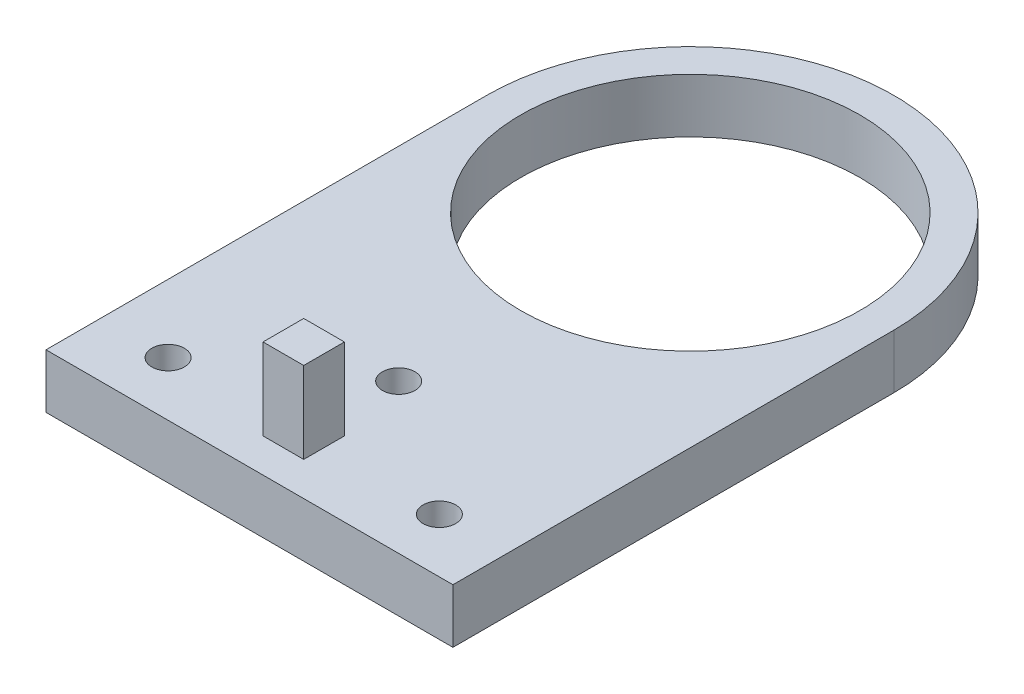
ISO-10303-21;
HEADER;
FILE_DESCRIPTION(('STEP AP214'),'2;1');
FILE_NAME('part.step','',(''),(''),'','','');
FILE_SCHEMA(('AUTOMOTIVE_DESIGN { 1 0 10303 214 1 1 1 1 }'));
ENDSEC;
DATA;
#1=APPLICATION_CONTEXT('core data for automotive mechanical design processes');
#2=APPLICATION_PROTOCOL_DEFINITION('international standard','automotive_design',2000,#1);
#3=PRODUCT_CONTEXT('',#1,'mechanical');
#4=PRODUCT('Part','Part','',(#3));
#5=PRODUCT_RELATED_PRODUCT_CATEGORY('part','',(#4));
#6=PRODUCT_DEFINITION_FORMATION('','',#4);
#7=PRODUCT_DEFINITION_CONTEXT('part definition',#1,'design');
#8=PRODUCT_DEFINITION('design','',#6,#7);
#9=PRODUCT_DEFINITION_SHAPE('','',#8);
#10=(LENGTH_UNIT() NAMED_UNIT(*) SI_UNIT(.MILLI.,.METRE.));
#11=(NAMED_UNIT(*) PLANE_ANGLE_UNIT() SI_UNIT($,.RADIAN.));
#12=(NAMED_UNIT(*) SI_UNIT($,.STERADIAN.) SOLID_ANGLE_UNIT());
#13=UNCERTAINTY_MEASURE_WITH_UNIT(LENGTH_MEASURE(1.E-05),#10,'distance_accuracy_value','');
#14=(GEOMETRIC_REPRESENTATION_CONTEXT(3) GLOBAL_UNCERTAINTY_ASSIGNED_CONTEXT((#13)) GLOBAL_UNIT_ASSIGNED_CONTEXT((#10,
#11,#12)) REPRESENTATION_CONTEXT('',''));
#15=CARTESIAN_POINT('',(0.,0.,0.));
#16=DIRECTION('',(0.,0.,1.));
#17=DIRECTION('',(1.,0.,0.));
#18=AXIS2_PLACEMENT_3D('',#15,#16,#17);
#19=CARTESIAN_POINT('',(0.,4.,-32.5));
#20=DIRECTION('',(0.,-1.,0.));
#21=DIRECTION('',(0.,0.,-1.));
#22=AXIS2_PLACEMENT_3D('',#19,#20,#21);
#23=PLANE('',#22);
#24=CARTESIAN_POINT('',(10.,4.,-4.));
#25=DIRECTION('',(0.,-1.,0.));
#26=DIRECTION('',(0.,0.,-1.));
#27=AXIS2_PLACEMENT_3D('',#24,#25,#26);
#28=CIRCLE('',#27,1.2);
#29=CARTESIAN_POINT('',(10.,4.,-5.2));
#30=VERTEX_POINT('',#29);
#31=EDGE_CURVE('E37',#30,#30,#28,.T.);
#32=ORIENTED_EDGE('',*,*,#31,.T.);
#33=EDGE_LOOP('',(#32));
#34=FACE_BOUND('',#33,.T.);
#35=CARTESIAN_POINT('',(-10.,4.,-4.));
#36=DIRECTION('',(0.,-1.,0.));
#37=DIRECTION('',(0.,0.,-1.));
#38=AXIS2_PLACEMENT_3D('',#35,#36,#37);
#39=CIRCLE('',#38,1.2);
#40=CARTESIAN_POINT('',(-10.,4.,-5.2));
#41=VERTEX_POINT('',#40);
#42=EDGE_CURVE('E161',#41,#41,#39,.T.);
#43=ORIENTED_EDGE('',*,*,#42,.T.);
#44=EDGE_LOOP('',(#43));
#45=FACE_BOUND('',#44,.T.);
#46=CARTESIAN_POINT('',(0.,4.,-11.));
#47=DIRECTION('',(0.,-1.,0.));
#48=DIRECTION('',(0.,0.,-1.));
#49=AXIS2_PLACEMENT_3D('',#46,#47,#48);
#50=CIRCLE('',#49,1.2);
#51=CARTESIAN_POINT('',(0.,4.,-12.2));
#52=VERTEX_POINT('',#51);
#53=EDGE_CURVE('E158',#52,#52,#50,.T.);
#54=ORIENTED_EDGE('',*,*,#53,.T.);
#55=EDGE_LOOP('',(#54));
#56=FACE_BOUND('',#55,.T.);
#57=DIRECTION('',(0.,0.,1.));
#58=VECTOR('',#57,1.);
#59=CARTESIAN_POINT('',(-15.,4.,0.));
#60=LINE('',#59,#58);
#61=CARTESIAN_POINT('',(-15.,4.,-32.5));
#62=VERTEX_POINT('',#61);
#63=CARTESIAN_POINT('',(-15.,4.,0.));
#64=VERTEX_POINT('',#63);
#65=EDGE_CURVE('E133',#62,#64,#60,.T.);
#66=ORIENTED_EDGE('',*,*,#65,.T.);
#67=DIRECTION('',(1.,0.,0.));
#68=VECTOR('',#67,1.);
#69=CARTESIAN_POINT('',(-15.,4.,0.));
#70=LINE('',#69,#68);
#71=CARTESIAN_POINT('',(15.,4.,0.));
#72=VERTEX_POINT('',#71);
#73=EDGE_CURVE('E136',#64,#72,#70,.T.);
#74=ORIENTED_EDGE('',*,*,#73,.T.);
#75=DIRECTION('',(0.,0.,-1.));
#76=VECTOR('',#75,1.);
#77=CARTESIAN_POINT('',(15.,4.,0.));
#78=LINE('',#77,#76);
#79=CARTESIAN_POINT('',(15.,4.,-32.5));
#80=VERTEX_POINT('',#79);
#81=EDGE_CURVE('E139',#72,#80,#78,.T.);
#82=ORIENTED_EDGE('',*,*,#81,.T.);
#83=CARTESIAN_POINT('',(0.,4.,-32.5));
#84=DIRECTION('',(0.,1.,0.));
#85=DIRECTION('',(0.,0.,-1.));
#86=AXIS2_PLACEMENT_3D('',#83,#84,#85);
#87=CIRCLE('',#86,15.);
#88=EDGE_CURVE('E141',#80,#62,#87,.T.);
#89=ORIENTED_EDGE('',*,*,#88,.T.);
#90=EDGE_LOOP('',(#66,#74,#82,#89));
#91=FACE_BOUND('',#90,.T.);
#92=CARTESIAN_POINT('',(0.,4.,-32.5));
#93=DIRECTION('',(0.,1.,0.));
#94=DIRECTION('',(0.,0.,1.));
#95=AXIS2_PLACEMENT_3D('',#92,#93,#94);
#96=CIRCLE('',#95,12.5);
#97=CARTESIAN_POINT('',(0.,4.,-20.));
#98=VERTEX_POINT('',#97);
#99=EDGE_CURVE('E124',#98,#98,#96,.T.);
#100=ORIENTED_EDGE('',*,*,#99,.F.);
#101=EDGE_LOOP('',(#100));
#102=FACE_BOUND('',#101,.T.);
#103=DIRECTION('',(0.,0.,1.));
#104=VECTOR('',#103,1.);
#105=CARTESIAN_POINT('',(-1.5,4.,-5.5));
#106=LINE('',#105,#104);
#107=CARTESIAN_POINT('',(-1.5,4.,-5.5));
#108=VERTEX_POINT('',#107);
#109=CARTESIAN_POINT('',(-1.5,4.,-2.5));
#110=VERTEX_POINT('',#109);
#111=EDGE_CURVE('E120',#108,#110,#106,.T.);
#112=ORIENTED_EDGE('',*,*,#111,.F.);
#113=DIRECTION('',(-1.,0.,0.));
#114=VECTOR('',#113,1.);
#115=CARTESIAN_POINT('',(-1.5,4.,-5.5));
#116=LINE('',#115,#114);
#117=CARTESIAN_POINT('',(1.5,4.,-5.5));
#118=VERTEX_POINT('',#117);
#119=EDGE_CURVE('E117',#118,#108,#116,.T.);
#120=ORIENTED_EDGE('',*,*,#119,.F.);
#121=DIRECTION('',(0.,0.,-1.));
#122=VECTOR('',#121,1.);
#123=CARTESIAN_POINT('',(1.5,4.,-5.5));
#124=LINE('',#123,#122);
#125=CARTESIAN_POINT('',(1.5,4.,-2.5));
#126=VERTEX_POINT('',#125);
#127=EDGE_CURVE('E55',#126,#118,#124,.T.);
#128=ORIENTED_EDGE('',*,*,#127,.F.);
#129=DIRECTION('',(1.,0.,0.));
#130=VECTOR('',#129,1.);
#131=CARTESIAN_POINT('',(-1.5,4.,-2.5));
#132=LINE('',#131,#130);
#133=EDGE_CURVE('E50',#110,#126,#132,.T.);
#134=ORIENTED_EDGE('',*,*,#133,.F.);
#135=EDGE_LOOP('',(#112,#120,#128,#134));
#136=FACE_BOUND('',#135,.T.);
#137=ADVANCED_FACE('F33',(#34,#45,#56,#91,#102,#136),#23,.F.);
#138=CARTESIAN_POINT('',(-15.,4.,0.));
#139=DIRECTION('',(1.,0.,0.));
#140=DIRECTION('',(0.,0.,-1.));
#141=AXIS2_PLACEMENT_3D('',#138,#139,#140);
#142=PLANE('',#141);
#143=DIRECTION('',(0.,0.,1.));
#144=VECTOR('',#143,1.);
#145=CARTESIAN_POINT('',(-15.,0.,0.));
#146=LINE('',#145,#144);
#147=CARTESIAN_POINT('',(-15.,0.,-32.5));
#148=VERTEX_POINT('',#147);
#149=CARTESIAN_POINT('',(-15.,0.,0.));
#150=VERTEX_POINT('',#149);
#151=EDGE_CURVE('E131',#148,#150,#146,.T.);
#152=ORIENTED_EDGE('',*,*,#151,.T.);
#153=DIRECTION('',(0.,-1.,0.));
#154=VECTOR('',#153,1.);
#155=CARTESIAN_POINT('',(-15.,4.,0.));
#156=LINE('',#155,#154);
#157=EDGE_CURVE('E11',#64,#150,#156,.T.);
#158=ORIENTED_EDGE('',*,*,#157,.F.);
#159=ORIENTED_EDGE('',*,*,#65,.F.);
#160=DIRECTION('',(0.,-1.,0.));
#161=VECTOR('',#160,1.);
#162=CARTESIAN_POINT('',(-15.,4.,-32.5));
#163=LINE('',#162,#161);
#164=EDGE_CURVE('E143',#62,#148,#163,.T.);
#165=ORIENTED_EDGE('',*,*,#164,.T.);
#166=EDGE_LOOP('',(#152,#158,#159,#165));
#167=FACE_BOUND('',#166,.T.);
#168=ADVANCED_FACE('F35',(#167),#142,.F.);
#169=CARTESIAN_POINT('',(-15.,4.,0.));
#170=DIRECTION('',(0.,0.,-1.));
#171=DIRECTION('',(-1.,0.,0.));
#172=AXIS2_PLACEMENT_3D('',#169,#170,#171);
#173=PLANE('',#172);
#174=DIRECTION('',(1.,0.,0.));
#175=VECTOR('',#174,1.);
#176=CARTESIAN_POINT('',(-15.,0.,0.));
#177=LINE('',#176,#175);
#178=CARTESIAN_POINT('',(15.,0.,0.));
#179=VERTEX_POINT('',#178);
#180=EDGE_CURVE('E146',#150,#179,#177,.T.);
#181=ORIENTED_EDGE('',*,*,#180,.T.);
#182=DIRECTION('',(0.,-1.,0.));
#183=VECTOR('',#182,1.);
#184=CARTESIAN_POINT('',(15.,4.,0.));
#185=LINE('',#184,#183);
#186=EDGE_CURVE('E42',#72,#179,#185,.T.);
#187=ORIENTED_EDGE('',*,*,#186,.F.);
#188=ORIENTED_EDGE('',*,*,#73,.F.);
#189=ORIENTED_EDGE('',*,*,#157,.T.);
#190=EDGE_LOOP('',(#181,#187,#188,#189));
#191=FACE_BOUND('',#190,.T.);
#192=ADVANCED_FACE('F208',(#191),#173,.F.);
#193=CARTESIAN_POINT('',(15.,4.,0.));
#194=DIRECTION('',(-1.,0.,0.));
#195=DIRECTION('',(0.,0.,1.));
#196=AXIS2_PLACEMENT_3D('',#193,#194,#195);
#197=PLANE('',#196);
#198=DIRECTION('',(0.,0.,-1.));
#199=VECTOR('',#198,1.);
#200=CARTESIAN_POINT('',(15.,0.,0.));
#201=LINE('',#200,#199);
#202=CARTESIAN_POINT('',(15.,0.,-32.5));
#203=VERTEX_POINT('',#202);
#204=EDGE_CURVE('E148',#179,#203,#201,.T.);
#205=ORIENTED_EDGE('',*,*,#204,.T.);
#206=DIRECTION('',(0.,-1.,0.));
#207=VECTOR('',#206,1.);
#208=CARTESIAN_POINT('',(15.,4.,-32.5));
#209=LINE('',#208,#207);
#210=EDGE_CURVE('E153',#80,#203,#209,.T.);
#211=ORIENTED_EDGE('',*,*,#210,.F.);
#212=ORIENTED_EDGE('',*,*,#81,.F.);
#213=ORIENTED_EDGE('',*,*,#186,.T.);
#214=EDGE_LOOP('',(#205,#211,#212,#213));
#215=FACE_BOUND('',#214,.T.);
#216=ADVANCED_FACE('F222',(#215),#197,.F.);
#217=CARTESIAN_POINT('',(0.,4.,-32.5));
#218=DIRECTION('',(0.,-1.,0.));
#219=DIRECTION('',(0.,0.,-1.));
#220=AXIS2_PLACEMENT_3D('',#217,#218,#219);
#221=CYLINDRICAL_SURFACE('',#220,15.);
#222=CARTESIAN_POINT('',(0.,0.,-32.5));
#223=DIRECTION('',(0.,1.,0.));
#224=DIRECTION('',(0.,0.,-1.));
#225=AXIS2_PLACEMENT_3D('',#222,#223,#224);
#226=CIRCLE('',#225,15.);
#227=EDGE_CURVE('E137',#203,#148,#226,.T.);
#228=ORIENTED_EDGE('',*,*,#227,.T.);
#229=ORIENTED_EDGE('',*,*,#164,.F.);
#230=ORIENTED_EDGE('',*,*,#88,.F.);
#231=ORIENTED_EDGE('',*,*,#210,.T.);
#232=EDGE_LOOP('',(#228,#229,#230,#231));
#233=FACE_BOUND('',#232,.T.);
#234=ADVANCED_FACE('F218',(#233),#221,.T.);
#235=CARTESIAN_POINT('',(0.,0.,-32.5));
#236=DIRECTION('',(0.,-1.,0.));
#237=DIRECTION('',(0.,0.,-1.));
#238=AXIS2_PLACEMENT_3D('',#235,#236,#237);
#239=PLANE('',#238);
#240=CARTESIAN_POINT('',(10.,0.,-4.));
#241=DIRECTION('',(0.,-1.,0.));
#242=DIRECTION('',(0.,0.,-1.));
#243=AXIS2_PLACEMENT_3D('',#240,#241,#242);
#244=CIRCLE('',#243,2.7);
#245=CARTESIAN_POINT('',(10.,0.,-6.7));
#246=VERTEX_POINT('',#245);
#247=EDGE_CURVE('E357',#246,#246,#244,.T.);
#248=ORIENTED_EDGE('',*,*,#247,.F.);
#249=EDGE_LOOP('',(#248));
#250=FACE_BOUND('',#249,.T.);
#251=CARTESIAN_POINT('',(-10.,0.,-4.));
#252=DIRECTION('',(0.,-1.,0.));
#253=DIRECTION('',(0.,0.,-1.));
#254=AXIS2_PLACEMENT_3D('',#251,#252,#253);
#255=CIRCLE('',#254,2.7);
#256=CARTESIAN_POINT('',(-10.,0.,-6.7));
#257=VERTEX_POINT('',#256);
#258=EDGE_CURVE('E170',#257,#257,#255,.T.);
#259=ORIENTED_EDGE('',*,*,#258,.F.);
#260=EDGE_LOOP('',(#259));
#261=FACE_BOUND('',#260,.T.);
#262=CARTESIAN_POINT('',(0.,0.,-11.));
#263=DIRECTION('',(0.,-1.,0.));
#264=DIRECTION('',(0.,0.,-1.));
#265=AXIS2_PLACEMENT_3D('',#262,#263,#264);
#266=CIRCLE('',#265,2.7);
#267=CARTESIAN_POINT('',(0.,0.,-13.7));
#268=VERTEX_POINT('',#267);
#269=EDGE_CURVE('E163',#268,#268,#266,.T.);
#270=ORIENTED_EDGE('',*,*,#269,.F.);
#271=EDGE_LOOP('',(#270));
#272=FACE_BOUND('',#271,.T.);
#273=CARTESIAN_POINT('',(0.,0.,-32.5));
#274=DIRECTION('',(0.,-1.,0.));
#275=DIRECTION('',(0.,0.,-1.));
#276=AXIS2_PLACEMENT_3D('',#273,#274,#275);
#277=CIRCLE('',#276,12.5);
#278=CARTESIAN_POINT('',(0.,0.,-45.));
#279=VERTEX_POINT('',#278);
#280=EDGE_CURVE('E121',#279,#279,#277,.F.);
#281=ORIENTED_EDGE('',*,*,#280,.T.);
#282=EDGE_LOOP('',(#281));
#283=FACE_BOUND('',#282,.T.);
#284=ORIENTED_EDGE('',*,*,#151,.F.);
#285=ORIENTED_EDGE('',*,*,#227,.F.);
#286=ORIENTED_EDGE('',*,*,#204,.F.);
#287=ORIENTED_EDGE('',*,*,#180,.F.);
#288=EDGE_LOOP('',(#284,#285,#286,#287));
#289=FACE_BOUND('',#288,.T.);
#290=ADVANCED_FACE('F215',(#250,#261,#272,#283,#289),#239,.T.);
#291=CARTESIAN_POINT('',(0.,-0.00100000000000013,-32.5));
#292=DIRECTION('',(0.,1.,0.));
#293=DIRECTION('',(0.,0.,1.));
#294=AXIS2_PLACEMENT_3D('',#291,#292,#293);
#295=CYLINDRICAL_SURFACE('',#294,12.5);
#296=ORIENTED_EDGE('',*,*,#280,.F.);
#297=EDGE_LOOP('',(#296));
#298=FACE_BOUND('',#297,.T.);
#299=ORIENTED_EDGE('',*,*,#99,.T.);
#300=EDGE_LOOP('',(#299));
#301=FACE_BOUND('',#300,.T.);
#302=ADVANCED_FACE('F213',(#298,#301),#295,.F.);
#303=CARTESIAN_POINT('',(-1.5,10.,-5.5));
#304=DIRECTION('',(1.,0.,0.));
#305=DIRECTION('',(0.,0.,-1.));
#306=AXIS2_PLACEMENT_3D('',#303,#304,#305);
#307=PLANE('',#306);
#308=ORIENTED_EDGE('',*,*,#111,.T.);
#309=DIRECTION('',(0.,-1.,0.));
#310=VECTOR('',#309,1.);
#311=CARTESIAN_POINT('',(-1.5,10.,-2.5));
#312=LINE('',#311,#310);
#313=CARTESIAN_POINT('',(-1.5,10.,-2.5));
#314=VERTEX_POINT('',#313);
#315=EDGE_CURVE('E101',#314,#110,#312,.T.);
#316=ORIENTED_EDGE('',*,*,#315,.F.);
#317=DIRECTION('',(0.,0.,1.));
#318=VECTOR('',#317,1.);
#319=CARTESIAN_POINT('',(-1.5,10.,-5.5));
#320=LINE('',#319,#318);
#321=CARTESIAN_POINT('',(-1.5,10.,-5.5));
#322=VERTEX_POINT('',#321);
#323=EDGE_CURVE('E108',#322,#314,#320,.T.);
#324=ORIENTED_EDGE('',*,*,#323,.F.);
#325=DIRECTION('',(0.,-1.,0.));
#326=VECTOR('',#325,1.);
#327=CARTESIAN_POINT('',(-1.5,10.,-5.5));
#328=LINE('',#327,#326);
#329=EDGE_CURVE('E182',#322,#108,#328,.T.);
#330=ORIENTED_EDGE('',*,*,#329,.T.);
#331=EDGE_LOOP('',(#308,#316,#324,#330));
#332=FACE_BOUND('',#331,.T.);
#333=ADVANCED_FACE('F119',(#332),#307,.F.);
#334=CARTESIAN_POINT('',(-1.5,10.,-2.5));
#335=DIRECTION('',(0.,0.,-1.));
#336=DIRECTION('',(-1.,0.,0.));
#337=AXIS2_PLACEMENT_3D('',#334,#335,#336);
#338=PLANE('',#337);
#339=ORIENTED_EDGE('',*,*,#133,.T.);
#340=DIRECTION('',(0.,-1.,0.));
#341=VECTOR('',#340,1.);
#342=CARTESIAN_POINT('',(1.5,10.,-2.5));
#343=LINE('',#342,#341);
#344=CARTESIAN_POINT('',(1.5,10.,-2.5));
#345=VERTEX_POINT('',#344);
#346=EDGE_CURVE('E104',#345,#126,#343,.T.);
#347=ORIENTED_EDGE('',*,*,#346,.F.);
#348=DIRECTION('',(1.,0.,0.));
#349=VECTOR('',#348,1.);
#350=CARTESIAN_POINT('',(-1.5,10.,-2.5));
#351=LINE('',#350,#349);
#352=EDGE_CURVE('E97',#314,#345,#351,.T.);
#353=ORIENTED_EDGE('',*,*,#352,.F.);
#354=ORIENTED_EDGE('',*,*,#315,.T.);
#355=EDGE_LOOP('',(#339,#347,#353,#354));
#356=FACE_BOUND('',#355,.T.);
#357=ADVANCED_FACE('F99',(#356),#338,.F.);
#358=CARTESIAN_POINT('',(1.5,10.,-5.5));
#359=DIRECTION('',(-1.,0.,0.));
#360=DIRECTION('',(0.,0.,1.));
#361=AXIS2_PLACEMENT_3D('',#358,#359,#360);
#362=PLANE('',#361);
#363=ORIENTED_EDGE('',*,*,#127,.T.);
#364=DIRECTION('',(0.,-1.,0.));
#365=VECTOR('',#364,1.);
#366=CARTESIAN_POINT('',(1.5,10.,-5.5));
#367=LINE('',#366,#365);
#368=CARTESIAN_POINT('',(1.5,10.,-5.5));
#369=VERTEX_POINT('',#368);
#370=EDGE_CURVE('E126',#369,#118,#367,.T.);
#371=ORIENTED_EDGE('',*,*,#370,.F.);
#372=DIRECTION('',(0.,0.,-1.));
#373=VECTOR('',#372,1.);
#374=CARTESIAN_POINT('',(1.5,10.,-5.5));
#375=LINE('',#374,#373);
#376=EDGE_CURVE('E107',#345,#369,#375,.T.);
#377=ORIENTED_EDGE('',*,*,#376,.F.);
#378=ORIENTED_EDGE('',*,*,#346,.T.);
#379=EDGE_LOOP('',(#363,#371,#377,#378));
#380=FACE_BOUND('',#379,.T.);
#381=ADVANCED_FACE('F193',(#380),#362,.F.);
#382=CARTESIAN_POINT('',(-1.5,10.,-5.5));
#383=DIRECTION('',(0.,0.,1.));
#384=DIRECTION('',(1.,0.,0.));
#385=AXIS2_PLACEMENT_3D('',#382,#383,#384);
#386=PLANE('',#385);
#387=ORIENTED_EDGE('',*,*,#119,.T.);
#388=ORIENTED_EDGE('',*,*,#329,.F.);
#389=DIRECTION('',(-1.,0.,0.));
#390=VECTOR('',#389,1.);
#391=CARTESIAN_POINT('',(-1.5,10.,-5.5));
#392=LINE('',#391,#390);
#393=EDGE_CURVE('E113',#369,#322,#392,.T.);
#394=ORIENTED_EDGE('',*,*,#393,.F.);
#395=ORIENTED_EDGE('',*,*,#370,.T.);
#396=EDGE_LOOP('',(#387,#388,#394,#395));
#397=FACE_BOUND('',#396,.T.);
#398=ADVANCED_FACE('F191',(#397),#386,.F.);
#399=CARTESIAN_POINT('',(0.,10.,0.));
#400=DIRECTION('',(0.,1.,0.));
#401=DIRECTION('',(0.,0.,1.));
#402=AXIS2_PLACEMENT_3D('',#399,#400,#401);
#403=PLANE('',#402);
#404=ORIENTED_EDGE('',*,*,#323,.T.);
#405=ORIENTED_EDGE('',*,*,#352,.T.);
#406=ORIENTED_EDGE('',*,*,#376,.T.);
#407=ORIENTED_EDGE('',*,*,#393,.T.);
#408=EDGE_LOOP('',(#404,#405,#406,#407));
#409=FACE_BOUND('',#408,.T.);
#410=ADVANCED_FACE('F111',(#409),#403,.T.);
#411=CARTESIAN_POINT('',(0.,0.,-11.));
#412=DIRECTION('',(0.,-1.,0.));
#413=DIRECTION('',(0.,0.,-1.));
#414=AXIS2_PLACEMENT_3D('',#411,#412,#413);
#415=CYLINDRICAL_SURFACE('',#414,1.2);
#416=CARTESIAN_POINT('',(0.,1.5,-11.));
#417=DIRECTION('',(0.,-1.,0.));
#418=DIRECTION('',(0.,0.,-1.));
#419=AXIS2_PLACEMENT_3D('',#416,#417,#418);
#420=CIRCLE('',#419,1.2);
#421=CARTESIAN_POINT('',(0.,1.5,-12.2));
#422=VERTEX_POINT('',#421);
#423=EDGE_CURVE('E160',#422,#422,#420,.T.);
#424=ORIENTED_EDGE('',*,*,#423,.T.);
#425=EDGE_LOOP('',(#424));
#426=FACE_BOUND('',#425,.T.);
#427=ORIENTED_EDGE('',*,*,#53,.F.);
#428=EDGE_LOOP('',(#427));
#429=FACE_BOUND('',#428,.T.);
#430=ADVANCED_FACE('F276',(#426,#429),#415,.F.);
#431=CARTESIAN_POINT('',(0.,0.,-11.));
#432=DIRECTION('',(0.,-1.,0.));
#433=DIRECTION('',(0.,0.,-1.));
#434=AXIS2_PLACEMENT_3D('',#431,#432,#433);
#435=CONICAL_SURFACE('',#434,2.7,0.785398163397448);
#436=ORIENTED_EDGE('',*,*,#423,.F.);
#437=EDGE_LOOP('',(#436));
#438=FACE_BOUND('',#437,.T.);
#439=ORIENTED_EDGE('',*,*,#269,.T.);
#440=EDGE_LOOP('',(#439));
#441=FACE_BOUND('',#440,.T.);
#442=ADVANCED_FACE('F298',(#438,#441),#435,.F.);
#443=CARTESIAN_POINT('',(-10.,0.,-4.));
#444=DIRECTION('',(0.,-1.,0.));
#445=DIRECTION('',(0.,0.,-1.));
#446=AXIS2_PLACEMENT_3D('',#443,#444,#445);
#447=CYLINDRICAL_SURFACE('',#446,1.2);
#448=CARTESIAN_POINT('',(-10.,1.5,-4.));
#449=DIRECTION('',(0.,-1.,0.));
#450=DIRECTION('',(0.,0.,-1.));
#451=AXIS2_PLACEMENT_3D('',#448,#449,#450);
#452=CIRCLE('',#451,1.2);
#453=CARTESIAN_POINT('',(-10.,1.5,-5.2));
#454=VERTEX_POINT('',#453);
#455=EDGE_CURVE('E164',#454,#454,#452,.T.);
#456=ORIENTED_EDGE('',*,*,#455,.T.);
#457=EDGE_LOOP('',(#456));
#458=FACE_BOUND('',#457,.T.);
#459=ORIENTED_EDGE('',*,*,#42,.F.);
#460=EDGE_LOOP('',(#459));
#461=FACE_BOUND('',#460,.T.);
#462=ADVANCED_FACE('F308',(#458,#461),#447,.F.);
#463=CARTESIAN_POINT('',(-10.,0.,-4.));
#464=DIRECTION('',(0.,-1.,0.));
#465=DIRECTION('',(0.,0.,-1.));
#466=AXIS2_PLACEMENT_3D('',#463,#464,#465);
#467=CONICAL_SURFACE('',#466,2.7,0.785398163397448);
#468=ORIENTED_EDGE('',*,*,#455,.F.);
#469=EDGE_LOOP('',(#468));
#470=FACE_BOUND('',#469,.T.);
#471=ORIENTED_EDGE('',*,*,#258,.T.);
#472=EDGE_LOOP('',(#471));
#473=FACE_BOUND('',#472,.T.);
#474=ADVANCED_FACE('F318',(#470,#473),#467,.F.);
#475=CARTESIAN_POINT('',(10.,0.,-4.));
#476=DIRECTION('',(0.,-1.,0.));
#477=DIRECTION('',(0.,0.,-1.));
#478=AXIS2_PLACEMENT_3D('',#475,#476,#477);
#479=CYLINDRICAL_SURFACE('',#478,1.2);
#480=CARTESIAN_POINT('',(10.,1.5,-4.));
#481=DIRECTION('',(0.,-1.,0.));
#482=DIRECTION('',(0.,0.,-1.));
#483=AXIS2_PLACEMENT_3D('',#480,#481,#482);
#484=CIRCLE('',#483,1.2);
#485=CARTESIAN_POINT('',(10.,1.5,-5.2));
#486=VERTEX_POINT('',#485);
#487=EDGE_CURVE('E354',#486,#486,#484,.T.);
#488=ORIENTED_EDGE('',*,*,#487,.T.);
#489=EDGE_LOOP('',(#488));
#490=FACE_BOUND('',#489,.T.);
#491=ORIENTED_EDGE('',*,*,#31,.F.);
#492=EDGE_LOOP('',(#491));
#493=FACE_BOUND('',#492,.T.);
#494=ADVANCED_FACE('F327',(#490,#493),#479,.F.);
#495=CARTESIAN_POINT('',(10.,0.,-4.));
#496=DIRECTION('',(0.,-1.,0.));
#497=DIRECTION('',(0.,0.,-1.));
#498=AXIS2_PLACEMENT_3D('',#495,#496,#497);
#499=CONICAL_SURFACE('',#498,2.7,0.785398163397449);
#500=ORIENTED_EDGE('',*,*,#487,.F.);
#501=EDGE_LOOP('',(#500));
#502=FACE_BOUND('',#501,.T.);
#503=ORIENTED_EDGE('',*,*,#247,.T.);
#504=EDGE_LOOP('',(#503));
#505=FACE_BOUND('',#504,.T.);
#506=ADVANCED_FACE('F337',(#502,#505),#499,.F.);
#507=CLOSED_SHELL('',(#137,#168,#192,#216,#234,#290,#302,#333,#357,#381,#398,#410,#430,#442,
#462,#474,#494,#506));
#508=MANIFOLD_SOLID_BREP('B2',#507);
#509=ADVANCED_BREP_SHAPE_REPRESENTATION('',(#18,#508),#14);
#510=SHAPE_DEFINITION_REPRESENTATION(#9,#509);
ENDSEC;
END-ISO-10303-21;
